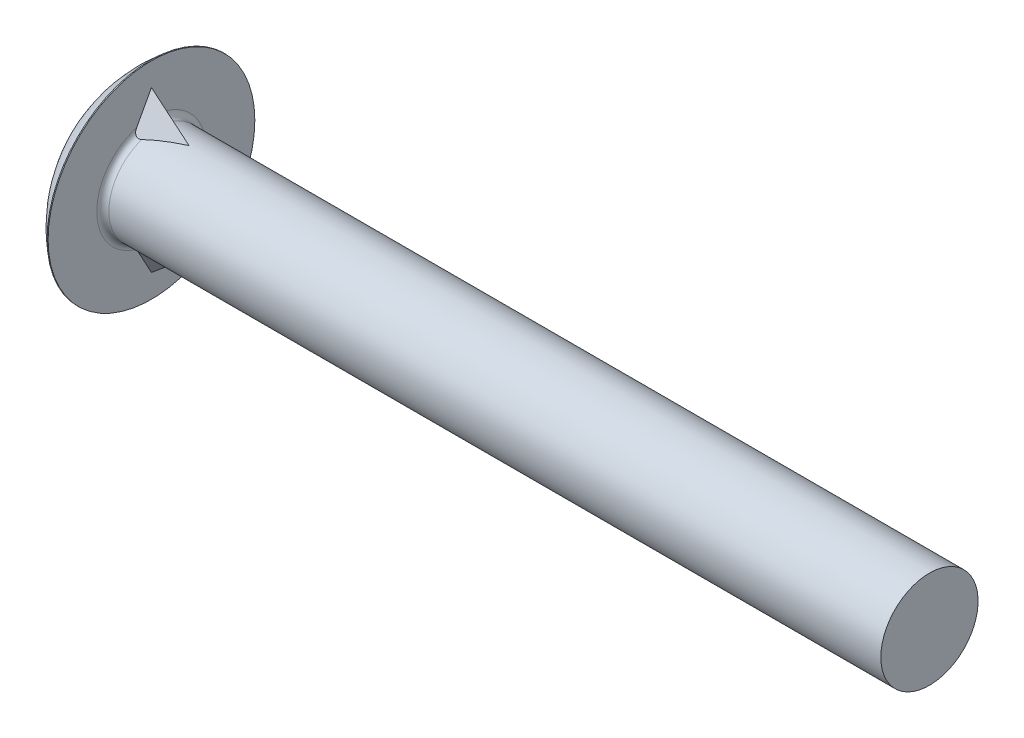
ISO-10303-21;
HEADER;
FILE_DESCRIPTION(('STEP AP214'),'2;1');
FILE_NAME('part.step','',(''),(''),'','','');
FILE_SCHEMA(('AUTOMOTIVE_DESIGN { 1 0 10303 214 1 1 1 1 }'));
ENDSEC;
DATA;
#1=APPLICATION_CONTEXT('core data for automotive mechanical design processes');
#2=APPLICATION_PROTOCOL_DEFINITION('international standard','automotive_design',2000,#1);
#3=PRODUCT_CONTEXT('',#1,'mechanical');
#4=PRODUCT('Part','Part','',(#3));
#5=PRODUCT_RELATED_PRODUCT_CATEGORY('part','',(#4));
#6=PRODUCT_DEFINITION_FORMATION('','',#4);
#7=PRODUCT_DEFINITION_CONTEXT('part definition',#1,'design');
#8=PRODUCT_DEFINITION('design','',#6,#7);
#9=PRODUCT_DEFINITION_SHAPE('','',#8);
#10=(LENGTH_UNIT() NAMED_UNIT(*) SI_UNIT(.MILLI.,.METRE.));
#11=(NAMED_UNIT(*) PLANE_ANGLE_UNIT() SI_UNIT($,.RADIAN.));
#12=(NAMED_UNIT(*) SI_UNIT($,.STERADIAN.) SOLID_ANGLE_UNIT());
#13=UNCERTAINTY_MEASURE_WITH_UNIT(LENGTH_MEASURE(1.E-05),#10,'distance_accuracy_value','');
#14=(GEOMETRIC_REPRESENTATION_CONTEXT(3) GLOBAL_UNCERTAINTY_ASSIGNED_CONTEXT((#13)) GLOBAL_UNIT_ASSIGNED_CONTEXT((#10,
#11,#12)) REPRESENTATION_CONTEXT('',''));
#15=CARTESIAN_POINT('',(0.,0.,0.));
#16=DIRECTION('',(0.,0.,1.));
#17=DIRECTION('',(1.,0.,0.));
#18=AXIS2_PLACEMENT_3D('',#15,#16,#17);
#19=CARTESIAN_POINT('',(0.,0.,0.));
#20=DIRECTION('',(-1.,0.,0.));
#21=DIRECTION('',(0.,0.,1.));
#22=AXIS2_PLACEMENT_3D('',#19,#20,#21);
#23=CYLINDRICAL_SURFACE('',#22,6.35);
#24=CARTESIAN_POINT('',(108.204,0.,0.));
#25=DIRECTION('',(-1.,0.,0.));
#26=DIRECTION('',(0.,0.,1.));
#27=AXIS2_PLACEMENT_3D('',#24,#25,#26);
#28=CIRCLE('',#27,6.35);
#29=CARTESIAN_POINT('',(108.204,0.,6.35));
#30=VERTEX_POINT('',#29);
#31=EDGE_CURVE('E161',#30,#30,#28,.T.);
#32=ORIENTED_EDGE('',*,*,#31,.T.);
#33=EDGE_LOOP('',(#32));
#34=FACE_BOUND('',#33,.T.);
#35=CARTESIAN_POINT('',(7.3914,0.,0.));
#36=DIRECTION('',(-1.,0.,0.));
#37=DIRECTION('',(0.,0.,1.));
#38=AXIS2_PLACEMENT_3D('',#35,#36,#37);
#39=CIRCLE('',#38,6.35);
#40=CARTESIAN_POINT('',(7.3914,-6.00637071604691,2.0605850677451));
#41=VERTEX_POINT('',#40);
#42=CARTESIAN_POINT('',(7.3914,6.0063707160469,2.06058506774514));
#43=VERTEX_POINT('',#42);
#44=EDGE_CURVE('E104',#41,#43,#39,.T.);
#45=ORIENTED_EDGE('',*,*,#44,.F.);
#46=CARTESIAN_POINT('',(19.0947448916408,0.,0.));
#47=DIRECTION('',(-0.371354260759642,0.443785587161683,-0.815567511395115));
#48=DIRECTION('',(-0.928491256294673,-0.177494044816193,0.326189900271494));
#49=AXIS2_PLACEMENT_3D('',#46,#47,#48);
#50=ELLIPSE('',#49,17.0995749099807,6.35);
#51=CARTESIAN_POINT('',(11.5062,-6.34999999999999,0.));
#52=VERTEX_POINT('',#51);
#53=EDGE_CURVE('E97',#41,#52,#50,.F.);
#54=ORIENTED_EDGE('',*,*,#53,.T.);
#55=CARTESIAN_POINT('',(19.0947448916408,0.,0.));
#56=DIRECTION('',(-0.371354260759642,0.443785587161671,0.815567511395121));
#57=DIRECTION('',(-0.928491256294673,-0.177494044816189,-0.326189900271497));
#58=AXIS2_PLACEMENT_3D('',#55,#56,#57);
#59=ELLIPSE('',#58,17.0995749099807,6.35);
#60=CARTESIAN_POINT('',(7.3914,-6.00637071604688,-2.06058506774519));
#61=VERTEX_POINT('',#60);
#62=EDGE_CURVE('E85',#52,#61,#59,.F.);
#63=ORIENTED_EDGE('',*,*,#62,.T.);
#64=CARTESIAN_POINT('',(7.3914,6.0063707160469,-2.06058506774514));
#65=VERTEX_POINT('',#64);
#66=EDGE_CURVE('E159',#65,#61,#39,.T.);
#67=ORIENTED_EDGE('',*,*,#66,.F.);
#68=CARTESIAN_POINT('',(19.0947448916408,0.,0.));
#69=DIRECTION('',(-0.371354260759642,-0.443785587161677,0.815567511395118));
#70=DIRECTION('',(-0.928491256294673,0.177494044816191,-0.326189900271496));
#71=AXIS2_PLACEMENT_3D('',#68,#69,#70);
#72=ELLIPSE('',#71,17.0995749099807,6.35);
#73=CARTESIAN_POINT('',(11.5062,6.34999999999999,0.));
#74=VERTEX_POINT('',#73);
#75=EDGE_CURVE('E146',#65,#74,#72,.F.);
#76=ORIENTED_EDGE('',*,*,#75,.T.);
#77=CARTESIAN_POINT('',(19.0947448916408,0.,0.));
#78=DIRECTION('',(-0.371354260759642,-0.443785587161677,-0.815567511395118));
#79=DIRECTION('',(-0.928491256294673,0.177494044816191,0.326189900271496));
#80=AXIS2_PLACEMENT_3D('',#77,#78,#79);
#81=ELLIPSE('',#80,17.0995749099807,6.35);
#82=EDGE_CURVE('E123',#74,#43,#81,.F.);
#83=ORIENTED_EDGE('',*,*,#82,.T.);
#84=EDGE_LOOP('',(#45,#54,#63,#67,#76,#83));
#85=FACE_BOUND('',#84,.T.);
#86=ADVANCED_FACE('F33',(#34,#85),#23,.T.);
#87=CARTESIAN_POINT('',(7.3914,0.,0.));
#88=DIRECTION('',(-1.,0.,0.));
#89=DIRECTION('',(0.,0.,1.));
#90=AXIS2_PLACEMENT_3D('',#87,#88,#89);
#91=TOROIDAL_SURFACE('',#90,7.1374,0.7874);
#92=CARTESIAN_POINT('',(7.3916,-6.00640916025956,2.06047308211748));
#93=CARTESIAN_POINT('',(7.36372668253858,-6.00103846264685,2.07608713394814));
#94=CARTESIAN_POINT('',(7.3350661036706,-5.99737529125948,2.09113051242026));
#95=CARTESIAN_POINT('',(7.27637319176004,-5.99418017591038,2.11959389372381));
#96=CARTESIAN_POINT('',(7.24632961749457,-5.99469200076406,2.1329951985404));
#97=CARTESIAN_POINT('',(7.18545385038679,-6.00072971363543,2.15742852289716));
#98=CARTESIAN_POINT('',(7.15461744630435,-6.00629297982389,2.16844212087039));
#99=CARTESIAN_POINT('',(7.09357934971212,-6.02295346895961,2.18716904668744));
#100=CARTESIAN_POINT('',(7.06337523222897,-6.03402249812407,2.19489882015771));
#101=CARTESIAN_POINT('',(7.00809759506671,-6.05995236497148,2.20595895285671));
#102=CARTESIAN_POINT('',(6.98283199941324,-6.07423608069556,2.20969080752792));
#103=CARTESIAN_POINT('',(6.9344357305327,-6.10647600666633,2.21418405440873));
#104=CARTESIAN_POINT('',(6.91130823110363,-6.12443755316553,2.21494109779949));
#105=CARTESIAN_POINT('',(6.86864109849111,-6.16239355441572,2.21371531967923));
#106=CARTESIAN_POINT('',(6.84899078233287,-6.18226922740328,2.21184753000505));
#107=CARTESIAN_POINT('',(6.81226461382312,-6.2239376984842,2.20589652327722));
#108=CARTESIAN_POINT('',(6.79518882372149,-6.24573054291298,2.2018132526661));
#109=CARTESIAN_POINT('',(6.75403898161933,-6.30417841537497,2.1887460889356));
#110=CARTESIAN_POINT('',(6.73193069466614,-6.34189072704575,2.17829180562889));
#111=CARTESIAN_POINT('',(6.69355369195164,-6.4190852363197,2.15376122186843));
#112=CARTESIAN_POINT('',(6.67730231258751,-6.45857230544227,2.13967437678787));
#113=CARTESIAN_POINT('',(6.64361793606035,-6.55681832622932,2.10155204988976));
#114=CARTESIAN_POINT('',(6.62916403531357,-6.61598231048577,2.07593969337321));
#115=CARTESIAN_POINT('',(6.60974716048733,-6.73394025953694,2.02059479812906));
#116=CARTESIAN_POINT('',(6.60480315872429,-6.79273325191312,1.99085414982729));
#117=CARTESIAN_POINT('',(6.6034817324366,-6.90020760414175,1.93297439055924));
#118=CARTESIAN_POINT('',(6.60595018002492,-6.94910322244687,1.9052442040418));
#119=CARTESIAN_POINT('',(6.61663481834018,-7.04488403564224,1.84826065609948));
#120=CARTESIAN_POINT('',(6.62480978901844,-7.091781104825,1.81901960217914));
#121=CARTESIAN_POINT('',(6.63565687022969,-7.1376,1.7891485310752));
#122=B_SPLINE_CURVE_WITH_KNOTS('',3,(#92,#93,#94,#95,#96,#97,#98,#99,#100,#101,#102,#103,#104,
#105,#106,#107,#108,#109,#110,#111,#112,#113,#114,#115,#116,#117,#118,#119,#120,#121),
.UNSPECIFIED.,.F.,.F.,(4,2,2,2,2,2,2,2,2,2,2,2,2,2,4),(0.,0.0973157695264637,0.19565305545234,
0.294723971776126,0.393292711639689,0.480608970293294,0.568052827506876,0.651781791903953,
0.7355127804724,0.86959039847046,1.00406168723563,1.20120281463663,1.3987368337332,
1.56718680164277,1.73443242533488),.UNSPECIFIED.);
#123=CARTESIAN_POINT('',(6.604,-6.86537516382892,1.95169224517622));
#124=VERTEX_POINT('',#123);
#125=EDGE_CURVE('E93',#41,#124,#122,.T.);
#126=ORIENTED_EDGE('',*,*,#125,.F.);
#127=ORIENTED_EDGE('',*,*,#44,.T.);
#128=CARTESIAN_POINT('',(6.63565687022971,7.1376,1.78914853107524));
#129=CARTESIAN_POINT('',(6.62756575236536,7.10347197339483,1.81140321528627));
#130=CARTESIAN_POINT('',(6.62097048079716,7.06874756641386,1.83330130868636));
#131=CARTESIAN_POINT('',(6.61089030382187,6.99825561012598,1.87624886408917));
#132=CARTESIAN_POINT('',(6.60741067936726,6.96248639543102,1.89729682771319));
#133=CARTESIAN_POINT('',(6.60368804895169,6.88976758027132,1.93856131689305));
#134=CARTESIAN_POINT('',(6.60348161839511,6.85280925913801,1.95876593377781));
#135=CARTESIAN_POINT('',(6.60660270740107,6.77837845129829,1.99784582552702));
#136=CARTESIAN_POINT('',(6.60992731731554,6.74090641300228,2.01672218124882));
#137=CARTESIAN_POINT('',(6.62183800574873,6.65522176147307,2.05792358765834));
#138=CARTESIAN_POINT('',(6.63163148395445,6.60692415003034,2.07974512143035));
#139=CARTESIAN_POINT('',(6.65822425740527,6.51091278372827,2.11988051228988));
#140=CARTESIAN_POINT('',(6.67499908229191,6.46319758294974,2.13820629831012));
#141=CARTESIAN_POINT('',(6.71090031974138,6.38257070600837,2.16573187788187));
#142=CARTESIAN_POINT('',(6.72811144039351,6.34919653169361,2.17605543103971));
#143=CARTESIAN_POINT('',(6.76724047188287,6.28439640350616,2.19349927250479));
#144=CARTESIAN_POINT('',(6.78915208415653,6.2529679143716,2.20062380829743));
#145=CARTESIAN_POINT('',(6.83250691649517,6.20006860371373,2.20966775600773));
#146=CARTESIAN_POINT('',(6.85297009597314,6.17793788918542,2.21239248844542));
#147=CARTESIAN_POINT('',(6.89679144335151,6.13654715548496,2.21496170186778));
#148=CARTESIAN_POINT('',(6.9201470693082,6.11728464800609,2.21480869427704));
#149=CARTESIAN_POINT('',(6.96948106562334,6.08240020722944,2.21132746475357));
#150=CARTESIAN_POINT('',(6.9954757741928,6.06680321733556,2.20797823071922));
#151=CARTESIAN_POINT('',(7.04910342336941,6.04012179959462,2.19807834227961));
#152=CARTESIAN_POINT('',(7.07673546801678,6.02903492943707,2.19152942480065));
#153=CARTESIAN_POINT('',(7.12993706191962,6.01240908722704,2.17635185917323));
#154=CARTESIAN_POINT('',(7.15544993305365,6.00643967166912,2.16798324135056));
#155=CARTESIAN_POINT('',(7.20639602906867,5.99813645249589,2.14930397738373));
#156=CARTESIAN_POINT('',(7.23182899446926,5.99580990639499,2.13898950026163));
#157=CARTESIAN_POINT('',(7.28010434488306,5.9944757135486,2.11773416423132));
#158=CARTESIAN_POINT('',(7.30299268596974,5.99522045030108,2.10690711889434));
#159=CARTESIAN_POINT('',(7.34793115847082,5.99911561151608,2.08432565336896));
#160=CARTESIAN_POINT('',(7.36998550261603,6.00225154309054,2.07257720119574));
#161=CARTESIAN_POINT('',(7.3916,6.00640916025955,2.06047308211752));
#162=B_SPLINE_CURVE_WITH_KNOTS('',3,(#128,#129,#130,#131,#132,#133,#134,#135,#136,#137,#138,
#139,#140,#141,#142,#143,#144,#145,#146,#147,#148,#149,#150,#151,#152,#153,#154,#155,#156,#157,
#158,#159,#160,#161),.UNSPECIFIED.,.F.,.F.,(4,2,2,2,2,2,2,2,2,2,2,2,2,2,2,2,4),(0.,
0.12459416941759,0.249399125584911,0.375597709784104,0.501692384444423,0.662902388568983,
0.823552031095049,0.940022894718177,1.05633865388524,1.14678047181559,1.23714336418156,
1.32810442723251,1.41901616746103,1.50119979878771,1.58354695324299,1.65939026096449,
1.73477750525471),.UNSPECIFIED.);
#163=CARTESIAN_POINT('',(6.604,6.86537516382891,1.95169224517627));
#164=VERTEX_POINT('',#163);
#165=EDGE_CURVE('E116',#164,#43,#162,.T.);
#166=ORIENTED_EDGE('',*,*,#165,.F.);
#167=CARTESIAN_POINT('',(6.604,0.,0.));
#168=DIRECTION('',(-1.,0.,0.));
#169=DIRECTION('',(0.,0.,1.));
#170=AXIS2_PLACEMENT_3D('',#167,#168,#169);
#171=CIRCLE('',#170,7.1374);
#172=EDGE_CURVE('E155',#124,#164,#171,.T.);
#173=ORIENTED_EDGE('',*,*,#172,.F.);
#174=EDGE_LOOP('',(#126,#127,#166,#173));
#175=FACE_BOUND('',#174,.T.);
#176=ADVANCED_FACE('F125',(#175),#91,.F.);
#177=CARTESIAN_POINT('',(6.63565687022971,-7.1376,-1.78914853107528));
#178=CARTESIAN_POINT('',(6.62756575236536,-7.10347197339483,-1.81140321528631));
#179=CARTESIAN_POINT('',(6.62097048079716,-7.06874756641386,-1.8333013086864));
#180=CARTESIAN_POINT('',(6.61089030382187,-6.99825561012598,-1.87624886408922));
#181=CARTESIAN_POINT('',(6.60741067936726,-6.96248639543102,-1.89729682771324));
#182=CARTESIAN_POINT('',(6.60368804895169,-6.88976758027132,-1.93856131689309));
#183=CARTESIAN_POINT('',(6.60348161839511,-6.852809259138,-1.95876593377785));
#184=CARTESIAN_POINT('',(6.60660270740107,-6.77837845129828,-1.99784582552706));
#185=CARTESIAN_POINT('',(6.60992731731554,-6.74090641300227,-2.01672218124886));
#186=CARTESIAN_POINT('',(6.62183800574872,-6.65522176147307,-2.05792358765838));
#187=CARTESIAN_POINT('',(6.63163148395445,-6.60692415003034,-2.07974512143039));
#188=CARTESIAN_POINT('',(6.65822425740527,-6.51091278372826,-2.11988051228993));
#189=CARTESIAN_POINT('',(6.67499908229191,-6.46319758294973,-2.13820629831017));
#190=CARTESIAN_POINT('',(6.71090031974138,-6.38257070600836,-2.16573187788191));
#191=CARTESIAN_POINT('',(6.72811144039351,-6.3491965316936,-2.17605543103975));
#192=CARTESIAN_POINT('',(6.76724047188287,-6.28439640350615,-2.19349927250483));
#193=CARTESIAN_POINT('',(6.78915208415653,-6.25296791437159,-2.20062380829747));
#194=CARTESIAN_POINT('',(6.83250691649516,-6.20006860371372,-2.20966775600777));
#195=CARTESIAN_POINT('',(6.85297009597313,-6.17793788918541,-2.21239248844546));
#196=CARTESIAN_POINT('',(6.89679144335151,-6.13654715548494,-2.21496170186783));
#197=CARTESIAN_POINT('',(6.92014706930819,-6.11728464800608,-2.21480869427708));
#198=CARTESIAN_POINT('',(6.96948106562334,-6.08240020722942,-2.21132746475361));
#199=CARTESIAN_POINT('',(6.9954757741928,-6.06680321733555,-2.20797823071927));
#200=CARTESIAN_POINT('',(7.0491034233694,-6.0401217995946,-2.19807834227966));
#201=CARTESIAN_POINT('',(7.07673546801678,-6.02903492943705,-2.19152942480069));
#202=CARTESIAN_POINT('',(7.12993706191962,-6.01240908722702,-2.17635185917328));
#203=CARTESIAN_POINT('',(7.15544993305365,-6.0064396716691,-2.16798324135061));
#204=CARTESIAN_POINT('',(7.20639602906867,-5.99813645249588,-2.14930397738377));
#205=CARTESIAN_POINT('',(7.23182899446925,-5.99580990639497,-2.13898950026167));
#206=CARTESIAN_POINT('',(7.28010434488306,-5.99447571354858,-2.11773416423136));
#207=CARTESIAN_POINT('',(7.30299268596974,-5.99522045030107,-2.10690711889438));
#208=CARTESIAN_POINT('',(7.34793115847081,-5.99911561151607,-2.084325653369));
#209=CARTESIAN_POINT('',(7.36998550261603,-6.00225154309052,-2.07257720119578));
#210=CARTESIAN_POINT('',(7.3916,-6.00640916025953,-2.06047308211756));
#211=B_SPLINE_CURVE_WITH_KNOTS('',3,(#177,#178,#179,#180,#181,#182,#183,#184,#185,#186,#187,
#188,#189,#190,#191,#192,#193,#194,#195,#196,#197,#198,#199,#200,#201,#202,#203,#204,#205,#206,
#207,#208,#209,#210),.UNSPECIFIED.,.F.,.F.,(4,2,2,2,2,2,2,2,2,2,2,2,2,2,2,2,4),(0.,
0.124594169417591,0.249399125584914,0.375597709784107,0.501692384444427,0.66290238856899,
0.823552031095058,0.940022894718186,1.05633865388525,1.1467804718156,1.23714336418157,
1.32810442723252,1.41901616746105,1.50119979878772,1.583546953243,1.6593902609645,
1.73477750525473),.UNSPECIFIED.);
#212=CARTESIAN_POINT('',(6.604,-6.8653751638289,-1.95169224517631));
#213=VERTEX_POINT('',#212);
#214=EDGE_CURVE('E88',#213,#61,#211,.T.);
#215=ORIENTED_EDGE('',*,*,#214,.F.);
#216=CARTESIAN_POINT('',(6.604,6.86537516382891,-1.95169224517627));
#217=VERTEX_POINT('',#216);
#218=EDGE_CURVE('E156',#217,#213,#171,.T.);
#219=ORIENTED_EDGE('',*,*,#218,.F.);
#220=CARTESIAN_POINT('',(7.3916,6.00640916025955,-2.06047308211752));
#221=CARTESIAN_POINT('',(7.36372668253858,6.00103846264684,-2.07608713394818));
#222=CARTESIAN_POINT('',(7.3350661036706,5.99737529125946,-2.0911305124203));
#223=CARTESIAN_POINT('',(7.27637319176004,5.99418017591036,-2.11959389372385));
#224=CARTESIAN_POINT('',(7.24632961749457,5.99469200076404,-2.13299519854044));
#225=CARTESIAN_POINT('',(7.18545385038679,6.00072971363542,-2.1574285228972));
#226=CARTESIAN_POINT('',(7.15461744630435,6.00629297982388,-2.16844212087044));
#227=CARTESIAN_POINT('',(7.09357934971212,6.02295346895959,-2.18716904668748));
#228=CARTESIAN_POINT('',(7.06337523222897,6.03402249812405,-2.19489882015775));
#229=CARTESIAN_POINT('',(7.00809759506671,6.05995236497147,-2.20595895285675));
#230=CARTESIAN_POINT('',(6.98283199941324,6.07423608069555,-2.20969080752796));
#231=CARTESIAN_POINT('',(6.93443573053271,6.10647600666631,-2.21418405440878));
#232=CARTESIAN_POINT('',(6.91130823110363,6.12443755316552,-2.21494109779953));
#233=CARTESIAN_POINT('',(6.86864109849111,6.1623935544157,-2.21371531967927));
#234=CARTESIAN_POINT('',(6.84899078233287,6.18226922740327,-2.21184753000509));
#235=CARTESIAN_POINT('',(6.81226461382313,6.22393769848419,-2.20589652327727));
#236=CARTESIAN_POINT('',(6.7951888237215,6.24573054291297,-2.20181325266614));
#237=CARTESIAN_POINT('',(6.75403898161933,6.30417841537495,-2.18874608893565));
#238=CARTESIAN_POINT('',(6.73193069466614,6.34189072704574,-2.17829180562893));
#239=CARTESIAN_POINT('',(6.69355369195164,6.41908523631969,-2.15376122186847));
#240=CARTESIAN_POINT('',(6.67730231258751,6.45857230544225,-2.13967437678792));
#241=CARTESIAN_POINT('',(6.64361793606035,6.5568183262293,-2.1015520498898));
#242=CARTESIAN_POINT('',(6.62916403531357,6.61598231048575,-2.07593969337326));
#243=CARTESIAN_POINT('',(6.60974716048733,6.73394025953693,-2.0205947981291));
#244=CARTESIAN_POINT('',(6.60480315872429,6.79273325191311,-1.99085414982734));
#245=CARTESIAN_POINT('',(6.6034817324366,6.90020760414174,-1.93297439055929));
#246=CARTESIAN_POINT('',(6.60595018002492,6.94910322244687,-1.90524420404184));
#247=CARTESIAN_POINT('',(6.61663481834018,7.04488403564224,-1.84826065609953));
#248=CARTESIAN_POINT('',(6.62480978901844,7.091781104825,-1.81901960217918));
#249=CARTESIAN_POINT('',(6.63565687022969,7.1376,-1.78914853107524));
#250=B_SPLINE_CURVE_WITH_KNOTS('',3,(#220,#221,#222,#223,#224,#225,#226,#227,#228,#229,#230,
#231,#232,#233,#234,#235,#236,#237,#238,#239,#240,#241,#242,#243,#244,#245,#246,#247,#248,#249),
.UNSPECIFIED.,.F.,.F.,(4,2,2,2,2,2,2,2,2,2,2,2,2,2,4),(0.,0.0973157695264637,0.19565305545234,
0.294723971776126,0.393292711639689,0.480608970293293,0.568052827506874,0.651781791903951,
0.735512780472397,0.869590398470457,1.00406168723562,1.20120281463663,1.3987368337332,
1.56718680164278,1.73443242533489),.UNSPECIFIED.);
#251=EDGE_CURVE('E141',#65,#217,#250,.T.);
#252=ORIENTED_EDGE('',*,*,#251,.F.);
#253=ORIENTED_EDGE('',*,*,#66,.T.);
#254=EDGE_LOOP('',(#215,#219,#252,#253));
#255=FACE_BOUND('',#254,.T.);
#256=ADVANCED_FACE('F170',(#255),#91,.F.);
#257=CARTESIAN_POINT('',(6.604,13.5001,0.));
#258=DIRECTION('',(1.,0.,0.));
#259=DIRECTION('',(0.,0.,-1.));
#260=AXIS2_PLACEMENT_3D('',#257,#258,#259);
#261=PLANE('',#260);
#262=CARTESIAN_POINT('',(6.604,0.,0.));
#263=DIRECTION('',(-1.,0.,0.));
#264=DIRECTION('',(0.,0.,1.));
#265=AXIS2_PLACEMENT_3D('',#262,#263,#264);
#266=CIRCLE('',#265,13.5001);
#267=CARTESIAN_POINT('',(6.604,0.,13.5001));
#268=VERTEX_POINT('',#267);
#269=EDGE_CURVE('E152',#268,#268,#266,.T.);
#270=ORIENTED_EDGE('',*,*,#269,.F.);
#271=EDGE_LOOP('',(#270));
#272=FACE_BOUND('',#271,.T.);
#273=DIRECTION('',(0.,0.878379312530958,-0.477964207151164));
#274=VECTOR('',#273,1.);
#275=CARTESIAN_POINT('',(6.604,-10.4521,0.));
#276=LINE('',#275,#274);
#277=CARTESIAN_POINT('',(6.604,-10.4521,0.));
#278=VERTEX_POINT('',#277);
#279=EDGE_CURVE('E100',#278,#213,#276,.T.);
#280=ORIENTED_EDGE('',*,*,#279,.F.);
#281=DIRECTION('',(0.,0.878379312530952,0.477964207151176));
#282=VECTOR('',#281,1.);
#283=CARTESIAN_POINT('',(6.604,8.02822510001896,10.0559448615375));
#284=LINE('',#283,#282);
#285=EDGE_CURVE('E12',#278,#124,#284,.T.);
#286=ORIENTED_EDGE('',*,*,#285,.T.);
#287=ORIENTED_EDGE('',*,*,#172,.T.);
#288=DIRECTION('',(0.,-0.878379312530955,0.47796420715117));
#289=VECTOR('',#288,1.);
#290=CARTESIAN_POINT('',(6.604,10.4521,0.));
#291=LINE('',#290,#289);
#292=CARTESIAN_POINT('',(6.604,10.4521,0.));
#293=VERTEX_POINT('',#292);
#294=EDGE_CURVE('E105',#293,#164,#291,.T.);
#295=ORIENTED_EDGE('',*,*,#294,.F.);
#296=DIRECTION('',(0.,-0.878379312530955,-0.47796420715117));
#297=VECTOR('',#296,1.);
#298=CARTESIAN_POINT('',(6.604,12.8037850604478,1.27965364091675));
#299=LINE('',#298,#297);
#300=EDGE_CURVE('E41',#293,#217,#299,.T.);
#301=ORIENTED_EDGE('',*,*,#300,.T.);
#302=ORIENTED_EDGE('',*,*,#218,.T.);
#303=EDGE_LOOP('',(#280,#286,#287,#295,#301,#302));
#304=FACE_BOUND('',#303,.T.);
#305=ADVANCED_FACE('F167',(#272,#304),#261,.T.);
#306=CARTESIAN_POINT('',(17.3077218627451,0.,0.));
#307=DIRECTION('',(-1.,0.,0.));
#308=DIRECTION('',(0.,1.,0.));
#309=AXIS2_PLACEMENT_3D('',#306,#307,#308);
#310=SPHERICAL_SURFACE('',#309,17.3077218627451);
#311=CARTESIAN_POINT('',(6.477,0.,0.));
#312=DIRECTION('',(-1.,0.,0.));
#313=DIRECTION('',(0.,0.,1.));
#314=AXIS2_PLACEMENT_3D('',#311,#312,#313);
#315=CIRCLE('',#314,13.5001);
#316=CARTESIAN_POINT('',(6.477,0.,13.5001));
#317=VERTEX_POINT('',#316);
#318=EDGE_CURVE('E149',#317,#317,#315,.T.);
#319=ORIENTED_EDGE('',*,*,#318,.T.);
#320=EDGE_LOOP('',(#319));
#321=FACE_BOUND('',#320,.T.);
#322=ADVANCED_FACE('F35',(#321),#310,.T.);
#323=CARTESIAN_POINT('',(108.204,6.35,0.));
#324=DIRECTION('',(1.,0.,0.));
#325=DIRECTION('',(0.,0.,-1.));
#326=AXIS2_PLACEMENT_3D('',#323,#324,#325);
#327=PLANE('',#326);
#328=ORIENTED_EDGE('',*,*,#31,.F.);
#329=EDGE_LOOP('',(#328));
#330=FACE_BOUND('',#329,.T.);
#331=ADVANCED_FACE('F187',(#330),#327,.T.);
#332=CARTESIAN_POINT('',(0.,0.,0.));
#333=DIRECTION('',(-1.,0.,0.));
#334=DIRECTION('',(0.,0.,1.));
#335=AXIS2_PLACEMENT_3D('',#332,#333,#334);
#336=CYLINDRICAL_SURFACE('',#335,13.5001);
#337=ORIENTED_EDGE('',*,*,#318,.F.);
#338=EDGE_LOOP('',(#337));
#339=FACE_BOUND('',#338,.T.);
#340=ORIENTED_EDGE('',*,*,#269,.T.);
#341=EDGE_LOOP('',(#340));
#342=FACE_BOUND('',#341,.T.);
#343=ADVANCED_FACE('F139',(#339,#342),#336,.T.);
#344=CARTESIAN_POINT('',(11.5062,1.72879074155912,-2.5146));
#345=DIRECTION('',(-0.371354260759642,-0.443785587161677,0.815567511395118));
#346=DIRECTION('',(0.,-0.878379312530955,-0.47796420715117));
#347=AXIS2_PLACEMENT_3D('',#344,#345,#346);
#348=PLANE('',#347);
#349=ORIENTED_EDGE('',*,*,#75,.F.);
#350=ORIENTED_EDGE('',*,*,#251,.T.);
#351=ORIENTED_EDGE('',*,*,#300,.F.);
#352=DIRECTION('',(-0.766916848608351,0.641746482125641,0.));
#353=VECTOR('',#352,1.);
#354=CARTESIAN_POINT('',(11.5062,6.34999999999999,0.));
#355=LINE('',#354,#353);
#356=EDGE_CURVE('E56',#74,#293,#355,.T.);
#357=ORIENTED_EDGE('',*,*,#356,.F.);
#358=EDGE_LOOP('',(#349,#350,#351,#357));
#359=FACE_BOUND('',#358,.T.);
#360=ADVANCED_FACE('F133',(#359),#348,.F.);
#361=CARTESIAN_POINT('',(11.5062,6.34999999999999,0.));
#362=DIRECTION('',(-0.371354260759642,-0.443785587161677,-0.815567511395118));
#363=DIRECTION('',(0.,0.878379312530955,-0.47796420715117));
#364=AXIS2_PLACEMENT_3D('',#361,#362,#363);
#365=PLANE('',#364);
#366=ORIENTED_EDGE('',*,*,#82,.F.);
#367=ORIENTED_EDGE('',*,*,#356,.T.);
#368=ORIENTED_EDGE('',*,*,#294,.T.);
#369=ORIENTED_EDGE('',*,*,#165,.T.);
#370=EDGE_LOOP('',(#366,#367,#368,#369));
#371=FACE_BOUND('',#370,.T.);
#372=ADVANCED_FACE('F129',(#371),#365,.F.);
#373=CARTESIAN_POINT('',(11.5062,-1.72879074155914,2.51459999999999));
#374=DIRECTION('',(-0.371354260759642,0.443785587161683,-0.815567511395115));
#375=DIRECTION('',(0.,0.878379312530952,0.477964207151176));
#376=AXIS2_PLACEMENT_3D('',#373,#374,#375);
#377=PLANE('',#376);
#378=ORIENTED_EDGE('',*,*,#53,.F.);
#379=ORIENTED_EDGE('',*,*,#125,.T.);
#380=ORIENTED_EDGE('',*,*,#285,.F.);
#381=DIRECTION('',(-0.766916848608351,-0.641746482125641,0.));
#382=VECTOR('',#381,1.);
#383=CARTESIAN_POINT('',(11.5062,-6.34999999999999,0.));
#384=LINE('',#383,#382);
#385=EDGE_CURVE('E48',#52,#278,#384,.T.);
#386=ORIENTED_EDGE('',*,*,#385,.F.);
#387=EDGE_LOOP('',(#378,#379,#380,#386));
#388=FACE_BOUND('',#387,.T.);
#389=ADVANCED_FACE('F96',(#388),#377,.F.);
#390=CARTESIAN_POINT('',(11.5062,-6.34999999999999,0.));
#391=DIRECTION('',(-0.371354260759642,0.443785587161671,0.815567511395121));
#392=DIRECTION('',(0.,-0.878379312530958,0.477964207151164));
#393=AXIS2_PLACEMENT_3D('',#390,#391,#392);
#394=PLANE('',#393);
#395=ORIENTED_EDGE('',*,*,#62,.F.);
#396=ORIENTED_EDGE('',*,*,#385,.T.);
#397=ORIENTED_EDGE('',*,*,#279,.T.);
#398=ORIENTED_EDGE('',*,*,#214,.T.);
#399=EDGE_LOOP('',(#395,#396,#397,#398));
#400=FACE_BOUND('',#399,.T.);
#401=ADVANCED_FACE('F86',(#400),#394,.F.);
#402=CLOSED_SHELL('',(#86,#176,#256,#305,#322,#331,#343,#360,#372,#389,#401));
#403=MANIFOLD_SOLID_BREP('B2',#402);
#404=ADVANCED_BREP_SHAPE_REPRESENTATION('',(#18,#403),#14);
#405=SHAPE_DEFINITION_REPRESENTATION(#9,#404);
ENDSEC;
END-ISO-10303-21;
